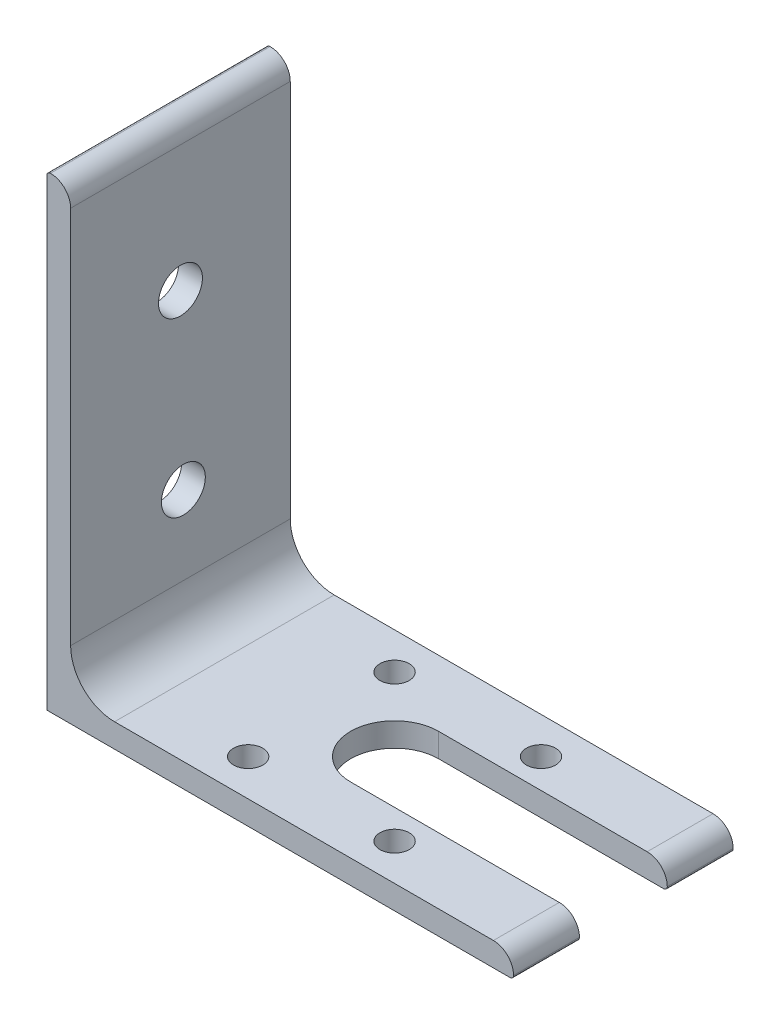
ISO-10303-21;
HEADER;
FILE_DESCRIPTION(('STEP AP214'),'2;1');
FILE_NAME('part.step','',(''),(''),'','','');
FILE_SCHEMA(('AUTOMOTIVE_DESIGN { 1 0 10303 214 1 1 1 1 }'));
ENDSEC;
DATA;
#1=APPLICATION_CONTEXT('core data for automotive mechanical design processes');
#2=APPLICATION_PROTOCOL_DEFINITION('international standard','automotive_design',2000,#1);
#3=PRODUCT_CONTEXT('',#1,'mechanical');
#4=PRODUCT('Part','Part','',(#3));
#5=PRODUCT_RELATED_PRODUCT_CATEGORY('part','',(#4));
#6=PRODUCT_DEFINITION_FORMATION('','',#4);
#7=PRODUCT_DEFINITION_CONTEXT('part definition',#1,'design');
#8=PRODUCT_DEFINITION('design','',#6,#7);
#9=PRODUCT_DEFINITION_SHAPE('','',#8);
#10=(LENGTH_UNIT() NAMED_UNIT(*) SI_UNIT(.MILLI.,.METRE.));
#11=(NAMED_UNIT(*) PLANE_ANGLE_UNIT() SI_UNIT($,.RADIAN.));
#12=(NAMED_UNIT(*) SI_UNIT($,.STERADIAN.) SOLID_ANGLE_UNIT());
#13=UNCERTAINTY_MEASURE_WITH_UNIT(LENGTH_MEASURE(1.E-05),#10,'distance_accuracy_value','');
#14=(GEOMETRIC_REPRESENTATION_CONTEXT(3) GLOBAL_UNCERTAINTY_ASSIGNED_CONTEXT((#13)) GLOBAL_UNIT_ASSIGNED_CONTEXT((#10,
#11,#12)) REPRESENTATION_CONTEXT('',''));
#15=CARTESIAN_POINT('',(0.,0.,0.));
#16=DIRECTION('',(0.,0.,1.));
#17=DIRECTION('',(1.,0.,0.));
#18=AXIS2_PLACEMENT_3D('',#15,#16,#17);
#19=CARTESIAN_POINT('',(61.,0.5,-30.));
#20=DIRECTION('',(0.,0.,1.));
#21=DIRECTION('',(1.,0.,0.));
#22=AXIS2_PLACEMENT_3D('',#19,#20,#21);
#23=CYLINDRICAL_SURFACE('',#22,2.75);
#24=CARTESIAN_POINT('',(61.,0.5,-21.0000000000003));
#25=DIRECTION('',(0.,0.,-1.));
#26=DIRECTION('',(-1.,0.,0.));
#27=AXIS2_PLACEMENT_3D('',#24,#25,#26);
#28=CIRCLE('',#27,2.75);
#29=CARTESIAN_POINT('',(63.75,0.499999999999981,-21.0000000000003));
#30=VERTEX_POINT('',#29);
#31=CARTESIAN_POINT('',(61.,3.25,-21.0000000000003));
#32=VERTEX_POINT('',#31);
#33=EDGE_CURVE('E307',#30,#32,#28,.F.);
#34=ORIENTED_EDGE('',*,*,#33,.F.);
#35=DIRECTION('',(0.,0.,1.));
#36=VECTOR('',#35,1.);
#37=CARTESIAN_POINT('',(63.75,0.499999999999981,-30.));
#38=LINE('',#37,#36);
#39=CARTESIAN_POINT('',(63.75,0.499999999999981,-30.));
#40=VERTEX_POINT('',#39);
#41=EDGE_CURVE('E206',#40,#30,#38,.T.);
#42=ORIENTED_EDGE('',*,*,#41,.F.);
#43=CARTESIAN_POINT('',(61.,0.5,-30.));
#44=DIRECTION('',(0.,0.,1.));
#45=DIRECTION('',(1.,0.,0.));
#46=AXIS2_PLACEMENT_3D('',#43,#44,#45);
#47=CIRCLE('',#46,2.75);
#48=CARTESIAN_POINT('',(61.,3.25,-30.));
#49=VERTEX_POINT('',#48);
#50=EDGE_CURVE('E342',#40,#49,#47,.T.);
#51=ORIENTED_EDGE('',*,*,#50,.T.);
#52=DIRECTION('',(0.,0.,1.));
#53=VECTOR('',#52,1.);
#54=CARTESIAN_POINT('',(61.,3.25,-30.));
#55=LINE('',#54,#53);
#56=EDGE_CURVE('E202',#49,#32,#55,.T.);
#57=ORIENTED_EDGE('',*,*,#56,.T.);
#58=EDGE_LOOP('',(#34,#42,#51,#57));
#59=FACE_BOUND('',#58,.T.);
#60=ADVANCED_FACE('F33',(#59),#23,.T.);
#61=CARTESIAN_POINT('',(63.75,0.499999999999981,-30.));
#62=DIRECTION('',(1.,0.,0.));
#63=DIRECTION('',(0.,0.,-1.));
#64=AXIS2_PLACEMENT_3D('',#61,#62,#63);
#65=PLANE('',#64);
#66=DIRECTION('',(0.,1.,0.));
#67=VECTOR('',#66,1.);
#68=CARTESIAN_POINT('',(63.75,0.499999999999981,-21.0000000000003));
#69=LINE('',#68,#67);
#70=CARTESIAN_POINT('',(63.75,0.490000000000003,-21.0000000000003));
#71=VERTEX_POINT('',#70);
#72=EDGE_CURVE('E304',#71,#30,#69,.T.);
#73=ORIENTED_EDGE('',*,*,#72,.F.);
#74=DIRECTION('',(0.,0.,1.));
#75=VECTOR('',#74,1.);
#76=CARTESIAN_POINT('',(63.75,0.490000000000003,-30.));
#77=LINE('',#76,#75);
#78=CARTESIAN_POINT('',(63.75,0.490000000000003,-30.));
#79=VERTEX_POINT('',#78);
#80=EDGE_CURVE('E210',#79,#71,#77,.T.);
#81=ORIENTED_EDGE('',*,*,#80,.F.);
#82=DIRECTION('',(0.,1.,0.));
#83=VECTOR('',#82,1.);
#84=CARTESIAN_POINT('',(63.75,0.499999999999981,-30.));
#85=LINE('',#84,#83);
#86=EDGE_CURVE('E339',#79,#40,#85,.T.);
#87=ORIENTED_EDGE('',*,*,#86,.T.);
#88=ORIENTED_EDGE('',*,*,#41,.T.);
#89=EDGE_LOOP('',(#73,#81,#87,#88));
#90=FACE_BOUND('',#89,.T.);
#91=ADVANCED_FACE('F242',(#90),#65,.T.);
#92=CARTESIAN_POINT('',(63.26,0.49,-30.));
#93=DIRECTION('',(0.,0.,1.));
#94=DIRECTION('',(1.,0.,0.));
#95=AXIS2_PLACEMENT_3D('',#92,#93,#94);
#96=CYLINDRICAL_SURFACE('',#95,0.490000000000002);
#97=CARTESIAN_POINT('',(63.26,0.49,-21.0000000000003));
#98=DIRECTION('',(0.,0.,-1.));
#99=DIRECTION('',(-1.,0.,0.));
#100=AXIS2_PLACEMENT_3D('',#97,#98,#99);
#101=CIRCLE('',#100,0.490000000000002);
#102=CARTESIAN_POINT('',(63.26,0.,-21.0000000000003));
#103=VERTEX_POINT('',#102);
#104=EDGE_CURVE('E284',#103,#71,#101,.F.);
#105=ORIENTED_EDGE('',*,*,#104,.F.);
#106=DIRECTION('',(0.,0.,1.));
#107=VECTOR('',#106,1.);
#108=CARTESIAN_POINT('',(63.26,0.,-30.));
#109=LINE('',#108,#107);
#110=CARTESIAN_POINT('',(63.26,0.,-30.));
#111=VERTEX_POINT('',#110);
#112=EDGE_CURVE('E214',#111,#103,#109,.T.);
#113=ORIENTED_EDGE('',*,*,#112,.F.);
#114=CARTESIAN_POINT('',(63.26,0.49,-30.));
#115=DIRECTION('',(0.,0.,1.));
#116=DIRECTION('',(1.,0.,0.));
#117=AXIS2_PLACEMENT_3D('',#114,#115,#116);
#118=CIRCLE('',#117,0.490000000000002);
#119=EDGE_CURVE('E336',#111,#79,#118,.T.);
#120=ORIENTED_EDGE('',*,*,#119,.T.);
#121=ORIENTED_EDGE('',*,*,#80,.T.);
#122=EDGE_LOOP('',(#105,#113,#120,#121));
#123=FACE_BOUND('',#122,.T.);
#124=ADVANCED_FACE('F233',(#123),#96,.T.);
#125=CARTESIAN_POINT('',(0.,0.,-30.));
#126=DIRECTION('',(-1.,0.,0.));
#127=DIRECTION('',(0.,0.,1.));
#128=AXIS2_PLACEMENT_3D('',#125,#126,#127);
#129=PLANE('',#128);
#130=CARTESIAN_POINT('',(0.,43.75,-15.));
#131=DIRECTION('',(-1.,0.,0.));
#132=DIRECTION('',(0.,0.,1.));
#133=AXIS2_PLACEMENT_3D('',#130,#131,#132);
#134=CIRCLE('',#133,3.);
#135=CARTESIAN_POINT('',(0.,43.75,-12.));
#136=VERTEX_POINT('',#135);
#137=EDGE_CURVE('E37',#136,#136,#134,.T.);
#138=ORIENTED_EDGE('',*,*,#137,.F.);
#139=EDGE_LOOP('',(#138));
#140=FACE_BOUND('',#139,.T.);
#141=CARTESIAN_POINT('',(0.,20.,-15.399206182849));
#142=DIRECTION('',(-1.,0.,0.));
#143=DIRECTION('',(0.,0.,1.));
#144=AXIS2_PLACEMENT_3D('',#141,#142,#143);
#145=CIRCLE('',#144,3.);
#146=CARTESIAN_POINT('',(0.,20.,-12.399206182849));
#147=VERTEX_POINT('',#146);
#148=EDGE_CURVE('E383',#147,#147,#145,.T.);
#149=ORIENTED_EDGE('',*,*,#148,.F.);
#150=EDGE_LOOP('',(#149));
#151=FACE_BOUND('',#150,.T.);
#152=DIRECTION('',(0.,-1.,0.));
#153=VECTOR('',#152,1.);
#154=CARTESIAN_POINT('',(0.,0.,0.));
#155=LINE('',#154,#153);
#156=CARTESIAN_POINT('',(0.,63.26,0.));
#157=VERTEX_POINT('',#156);
#158=CARTESIAN_POINT('',(0.,0.,0.));
#159=VERTEX_POINT('',#158);
#160=EDGE_CURVE('E163',#157,#159,#155,.T.);
#161=ORIENTED_EDGE('',*,*,#160,.F.);
#162=DIRECTION('',(0.,0.,1.));
#163=VECTOR('',#162,1.);
#164=CARTESIAN_POINT('',(0.,63.26,-30.));
#165=LINE('',#164,#163);
#166=CARTESIAN_POINT('',(0.,63.26,-30.));
#167=VERTEX_POINT('',#166);
#168=EDGE_CURVE('E42',#167,#157,#165,.T.);
#169=ORIENTED_EDGE('',*,*,#168,.F.);
#170=DIRECTION('',(0.,-1.,0.));
#171=VECTOR('',#170,1.);
#172=CARTESIAN_POINT('',(0.,0.,-30.));
#173=LINE('',#172,#171);
#174=CARTESIAN_POINT('',(0.,0.,-30.));
#175=VERTEX_POINT('',#174);
#176=EDGE_CURVE('E194',#167,#175,#173,.T.);
#177=ORIENTED_EDGE('',*,*,#176,.T.);
#178=DIRECTION('',(0.,0.,1.));
#179=VECTOR('',#178,1.);
#180=CARTESIAN_POINT('',(0.,0.,-30.));
#181=LINE('',#180,#179);
#182=EDGE_CURVE('E105',#175,#159,#181,.T.);
#183=ORIENTED_EDGE('',*,*,#182,.T.);
#184=EDGE_LOOP('',(#161,#169,#177,#183));
#185=FACE_BOUND('',#184,.T.);
#186=ADVANCED_FACE('F35',(#140,#151,#185),#129,.T.);
#187=CARTESIAN_POINT('',(0.49,63.26,-30.));
#188=DIRECTION('',(0.,0.,1.));
#189=DIRECTION('',(1.,0.,0.));
#190=AXIS2_PLACEMENT_3D('',#187,#188,#189);
#191=CYLINDRICAL_SURFACE('',#190,0.490000000000002);
#192=CARTESIAN_POINT('',(0.49,63.26,0.));
#193=DIRECTION('',(0.,0.,1.));
#194=DIRECTION('',(1.,0.,0.));
#195=AXIS2_PLACEMENT_3D('',#192,#193,#194);
#196=CIRCLE('',#195,0.490000000000002);
#197=CARTESIAN_POINT('',(0.49,63.75,0.));
#198=VERTEX_POINT('',#197);
#199=EDGE_CURVE('E191',#198,#157,#196,.T.);
#200=ORIENTED_EDGE('',*,*,#199,.F.);
#201=DIRECTION('',(0.,0.,1.));
#202=VECTOR('',#201,1.);
#203=CARTESIAN_POINT('',(0.49,63.75,-30.));
#204=LINE('',#203,#202);
#205=CARTESIAN_POINT('',(0.49,63.75,-30.));
#206=VERTEX_POINT('',#205);
#207=EDGE_CURVE('E144',#206,#198,#204,.T.);
#208=ORIENTED_EDGE('',*,*,#207,.F.);
#209=CARTESIAN_POINT('',(0.49,63.26,-30.));
#210=DIRECTION('',(0.,0.,1.));
#211=DIRECTION('',(1.,0.,0.));
#212=AXIS2_PLACEMENT_3D('',#209,#210,#211);
#213=CIRCLE('',#212,0.490000000000002);
#214=EDGE_CURVE('E153',#206,#167,#213,.T.);
#215=ORIENTED_EDGE('',*,*,#214,.T.);
#216=ORIENTED_EDGE('',*,*,#168,.T.);
#217=EDGE_LOOP('',(#200,#208,#215,#216));
#218=FACE_BOUND('',#217,.T.);
#219=ADVANCED_FACE('F232',(#218),#191,.T.);
#220=CARTESIAN_POINT('',(0.49,63.75,-30.));
#221=DIRECTION('',(0.,1.,0.));
#222=DIRECTION('',(0.,0.,1.));
#223=AXIS2_PLACEMENT_3D('',#220,#221,#222);
#224=PLANE('',#223);
#225=DIRECTION('',(-1.,0.,0.));
#226=VECTOR('',#225,1.);
#227=CARTESIAN_POINT('',(0.49,63.75,0.));
#228=LINE('',#227,#226);
#229=CARTESIAN_POINT('',(0.500000000000001,63.75,0.));
#230=VERTEX_POINT('',#229);
#231=EDGE_CURVE('E139',#230,#198,#228,.T.);
#232=ORIENTED_EDGE('',*,*,#231,.F.);
#233=DIRECTION('',(0.,0.,1.));
#234=VECTOR('',#233,1.);
#235=CARTESIAN_POINT('',(0.500000000000001,63.75,-30.));
#236=LINE('',#235,#234);
#237=CARTESIAN_POINT('',(0.500000000000001,63.75,-30.));
#238=VERTEX_POINT('',#237);
#239=EDGE_CURVE('E133',#238,#230,#236,.T.);
#240=ORIENTED_EDGE('',*,*,#239,.F.);
#241=DIRECTION('',(-1.,0.,0.));
#242=VECTOR('',#241,1.);
#243=CARTESIAN_POINT('',(0.49,63.75,-30.));
#244=LINE('',#243,#242);
#245=EDGE_CURVE('E136',#238,#206,#244,.T.);
#246=ORIENTED_EDGE('',*,*,#245,.T.);
#247=ORIENTED_EDGE('',*,*,#207,.T.);
#248=EDGE_LOOP('',(#232,#240,#246,#247));
#249=FACE_BOUND('',#248,.T.);
#250=ADVANCED_FACE('F135',(#249),#224,.T.);
#251=CARTESIAN_POINT('',(0.5,61.,-30.));
#252=DIRECTION('',(0.,0.,1.));
#253=DIRECTION('',(1.,0.,0.));
#254=AXIS2_PLACEMENT_3D('',#251,#252,#253);
#255=CYLINDRICAL_SURFACE('',#254,2.75);
#256=CARTESIAN_POINT('',(0.5,61.,0.));
#257=DIRECTION('',(0.,0.,1.));
#258=DIRECTION('',(1.,0.,0.));
#259=AXIS2_PLACEMENT_3D('',#256,#257,#258);
#260=CIRCLE('',#259,2.75);
#261=CARTESIAN_POINT('',(3.25,61.,0.));
#262=VERTEX_POINT('',#261);
#263=EDGE_CURVE('E188',#262,#230,#260,.T.);
#264=ORIENTED_EDGE('',*,*,#263,.F.);
#265=DIRECTION('',(0.,0.,1.));
#266=VECTOR('',#265,1.);
#267=CARTESIAN_POINT('',(3.25,61.,-30.));
#268=LINE('',#267,#266);
#269=CARTESIAN_POINT('',(3.25,61.,-30.));
#270=VERTEX_POINT('',#269);
#271=EDGE_CURVE('E145',#270,#262,#268,.T.);
#272=ORIENTED_EDGE('',*,*,#271,.F.);
#273=CARTESIAN_POINT('',(0.5,61.,-30.));
#274=DIRECTION('',(0.,0.,1.));
#275=DIRECTION('',(1.,0.,0.));
#276=AXIS2_PLACEMENT_3D('',#273,#274,#275);
#277=CIRCLE('',#276,2.75);
#278=EDGE_CURVE('E151',#270,#238,#277,.T.);
#279=ORIENTED_EDGE('',*,*,#278,.T.);
#280=ORIENTED_EDGE('',*,*,#239,.T.);
#281=EDGE_LOOP('',(#264,#272,#279,#280));
#282=FACE_BOUND('',#281,.T.);
#283=ADVANCED_FACE('F155',(#282),#255,.T.);
#284=CARTESIAN_POINT('',(3.25,61.,-30.));
#285=DIRECTION('',(1.,0.,0.));
#286=DIRECTION('',(0.,1.,0.));
#287=AXIS2_PLACEMENT_3D('',#284,#285,#286);
#288=PLANE('',#287);
#289=CARTESIAN_POINT('',(3.25,43.75,-15.));
#290=DIRECTION('',(1.,0.,0.));
#291=DIRECTION('',(0.,0.,-1.));
#292=AXIS2_PLACEMENT_3D('',#289,#290,#291);
#293=CIRCLE('',#292,3.);
#294=CARTESIAN_POINT('',(3.25,43.75,-18.));
#295=VERTEX_POINT('',#294);
#296=EDGE_CURVE('E541',#295,#295,#293,.T.);
#297=ORIENTED_EDGE('',*,*,#296,.F.);
#298=EDGE_LOOP('',(#297));
#299=FACE_BOUND('',#298,.T.);
#300=CARTESIAN_POINT('',(3.25000000000001,20.,-15.399206182849));
#301=DIRECTION('',(1.,0.,0.));
#302=DIRECTION('',(0.,0.,-1.));
#303=AXIS2_PLACEMENT_3D('',#300,#301,#302);
#304=CIRCLE('',#303,3.);
#305=CARTESIAN_POINT('',(3.25000000000001,20.,-18.399206182849));
#306=VERTEX_POINT('',#305);
#307=EDGE_CURVE('E543',#306,#306,#304,.T.);
#308=ORIENTED_EDGE('',*,*,#307,.F.);
#309=EDGE_LOOP('',(#308));
#310=FACE_BOUND('',#309,.T.);
#311=DIRECTION('',(0.,1.,0.));
#312=VECTOR('',#311,1.);
#313=CARTESIAN_POINT('',(3.25,61.,0.));
#314=LINE('',#313,#312);
#315=CARTESIAN_POINT('',(3.25000000000001,9.25000000000004,0.));
#316=VERTEX_POINT('',#315);
#317=EDGE_CURVE('E185',#316,#262,#314,.T.);
#318=ORIENTED_EDGE('',*,*,#317,.F.);
#319=DIRECTION('',(0.,0.,1.));
#320=VECTOR('',#319,1.);
#321=CARTESIAN_POINT('',(3.25000000000001,9.25000000000004,-30.));
#322=LINE('',#321,#320);
#323=CARTESIAN_POINT('',(3.25000000000001,9.25000000000004,-30.));
#324=VERTEX_POINT('',#323);
#325=EDGE_CURVE('E198',#324,#316,#322,.T.);
#326=ORIENTED_EDGE('',*,*,#325,.F.);
#327=DIRECTION('',(0.,1.,0.));
#328=VECTOR('',#327,1.);
#329=CARTESIAN_POINT('',(3.25,61.,-30.));
#330=LINE('',#329,#328);
#331=EDGE_CURVE('E156',#324,#270,#330,.T.);
#332=ORIENTED_EDGE('',*,*,#331,.T.);
#333=ORIENTED_EDGE('',*,*,#271,.T.);
#334=EDGE_LOOP('',(#318,#326,#332,#333));
#335=FACE_BOUND('',#334,.T.);
#336=ADVANCED_FACE('F429',(#299,#310,#335),#288,.T.);
#337=CARTESIAN_POINT('',(9.25000000000001,9.25,-30.));
#338=DIRECTION('',(0.,0.,1.));
#339=DIRECTION('',(1.,0.,0.));
#340=AXIS2_PLACEMENT_3D('',#337,#338,#339);
#341=CYLINDRICAL_SURFACE('',#340,6.);
#342=CARTESIAN_POINT('',(9.25000000000001,9.25,0.));
#343=DIRECTION('',(0.,0.,-1.));
#344=DIRECTION('',(-1.,0.,0.));
#345=AXIS2_PLACEMENT_3D('',#342,#343,#344);
#346=CIRCLE('',#345,6.);
#347=CARTESIAN_POINT('',(9.25000000000005,3.25,0.));
#348=VERTEX_POINT('',#347);
#349=EDGE_CURVE('E182',#348,#316,#346,.T.);
#350=ORIENTED_EDGE('',*,*,#349,.F.);
#351=DIRECTION('',(0.,0.,1.));
#352=VECTOR('',#351,1.);
#353=CARTESIAN_POINT('',(9.25000000000005,3.25,-30.));
#354=LINE('',#353,#352);
#355=CARTESIAN_POINT('',(9.25000000000005,3.25,-30.));
#356=VERTEX_POINT('',#355);
#357=EDGE_CURVE('E200',#356,#348,#354,.T.);
#358=ORIENTED_EDGE('',*,*,#357,.F.);
#359=CARTESIAN_POINT('',(9.25000000000001,9.25,-30.));
#360=DIRECTION('',(0.,0.,-1.));
#361=DIRECTION('',(-1.,0.,0.));
#362=AXIS2_PLACEMENT_3D('',#359,#360,#361);
#363=CIRCLE('',#362,6.);
#364=EDGE_CURVE('E158',#356,#324,#363,.T.);
#365=ORIENTED_EDGE('',*,*,#364,.T.);
#366=ORIENTED_EDGE('',*,*,#325,.T.);
#367=EDGE_LOOP('',(#350,#358,#365,#366));
#368=FACE_BOUND('',#367,.T.);
#369=ADVANCED_FACE('F268',(#368),#341,.F.);
#370=CARTESIAN_POINT('',(9.25000000000005,3.25,-30.));
#371=DIRECTION('',(0.,1.,0.));
#372=DIRECTION('',(0.,0.,1.));
#373=AXIS2_PLACEMENT_3D('',#370,#371,#372);
#374=PLANE('',#373);
#375=DIRECTION('',(-1.,0.,0.));
#376=VECTOR('',#375,1.);
#377=CARTESIAN_POINT('',(32.499999999993,3.25,-21.0000000000003));
#378=LINE('',#377,#376);
#379=CARTESIAN_POINT('',(32.499999999993,3.25,-21.0000000000003));
#380=VERTEX_POINT('',#379);
#381=EDGE_CURVE('E353',#32,#380,#378,.T.);
#382=ORIENTED_EDGE('',*,*,#381,.F.);
#383=ORIENTED_EDGE('',*,*,#56,.F.);
#384=DIRECTION('',(-1.,0.,0.));
#385=VECTOR('',#384,1.);
#386=CARTESIAN_POINT('',(9.25000000000005,3.25,-30.));
#387=LINE('',#386,#385);
#388=EDGE_CURVE('E345',#49,#356,#387,.T.);
#389=ORIENTED_EDGE('',*,*,#388,.T.);
#390=ORIENTED_EDGE('',*,*,#357,.T.);
#391=DIRECTION('',(-1.,0.,0.));
#392=VECTOR('',#391,1.);
#393=CARTESIAN_POINT('',(9.25000000000005,3.25,0.));
#394=LINE('',#393,#392);
#395=CARTESIAN_POINT('',(61.,3.25,0.));
#396=VERTEX_POINT('',#395);
#397=EDGE_CURVE('E179',#396,#348,#394,.T.);
#398=ORIENTED_EDGE('',*,*,#397,.F.);
#399=CARTESIAN_POINT('',(61.,3.25,-9.00000000000028));
#400=VERTEX_POINT('',#399);
#401=EDGE_CURVE('E205',#400,#396,#55,.T.);
#402=ORIENTED_EDGE('',*,*,#401,.F.);
#403=DIRECTION('',(1.,0.,0.));
#404=VECTOR('',#403,1.);
#405=CARTESIAN_POINT('',(32.499999999993,3.25,-9.00000000000028));
#406=LINE('',#405,#404);
#407=CARTESIAN_POINT('',(32.499999999993,3.25,-9.00000000000028));
#408=VERTEX_POINT('',#407);
#409=EDGE_CURVE('E292',#408,#400,#406,.T.);
#410=ORIENTED_EDGE('',*,*,#409,.F.);
#411=CARTESIAN_POINT('',(32.499999999993,3.25,-15.0000000000003));
#412=DIRECTION('',(0.,1.,0.));
#413=DIRECTION('',(0.,0.,1.));
#414=AXIS2_PLACEMENT_3D('',#411,#412,#413);
#415=CIRCLE('',#414,6.00000000000001);
#416=EDGE_CURVE('E386',#380,#408,#415,.T.);
#417=ORIENTED_EDGE('',*,*,#416,.F.);
#418=EDGE_LOOP('',(#382,#383,#389,#390,#398,#402,#410,#417));
#419=FACE_BOUND('',#418,.T.);
#420=CARTESIAN_POINT('',(22.4999999999933,3.25,-5.));
#421=DIRECTION('',(0.,1.,0.));
#422=DIRECTION('',(0.,0.,1.));
#423=AXIS2_PLACEMENT_3D('',#420,#421,#422);
#424=CIRCLE('',#423,1.99999999999999);
#425=CARTESIAN_POINT('',(22.4999999999933,3.25,-3.00000000000001));
#426=VERTEX_POINT('',#425);
#427=EDGE_CURVE('E310',#426,#426,#424,.T.);
#428=ORIENTED_EDGE('',*,*,#427,.F.);
#429=EDGE_LOOP('',(#428));
#430=FACE_BOUND('',#429,.T.);
#431=CARTESIAN_POINT('',(22.4999999999927,3.25,-25.));
#432=DIRECTION('',(0.,1.,0.));
#433=DIRECTION('',(0.,0.,1.));
#434=AXIS2_PLACEMENT_3D('',#431,#432,#433);
#435=CIRCLE('',#434,1.99999999999999);
#436=CARTESIAN_POINT('',(22.4999999999927,3.25,-23.));
#437=VERTEX_POINT('',#436);
#438=EDGE_CURVE('E316',#437,#437,#435,.T.);
#439=ORIENTED_EDGE('',*,*,#438,.F.);
#440=EDGE_LOOP('',(#439));
#441=FACE_BOUND('',#440,.T.);
#442=CARTESIAN_POINT('',(42.4999999999927,3.25,-25.0000000000006));
#443=DIRECTION('',(0.,1.,0.));
#444=DIRECTION('',(0.,0.,1.));
#445=AXIS2_PLACEMENT_3D('',#442,#443,#444);
#446=CIRCLE('',#445,1.99999999999999);
#447=CARTESIAN_POINT('',(42.4999999999927,3.25,-23.0000000000006));
#448=VERTEX_POINT('',#447);
#449=EDGE_CURVE('E322',#448,#448,#446,.T.);
#450=ORIENTED_EDGE('',*,*,#449,.F.);
#451=EDGE_LOOP('',(#450));
#452=FACE_BOUND('',#451,.T.);
#453=CARTESIAN_POINT('',(42.4999999999933,3.25,-5.00000000000056));
#454=DIRECTION('',(0.,1.,0.));
#455=DIRECTION('',(0.,0.,1.));
#456=AXIS2_PLACEMENT_3D('',#453,#454,#455);
#457=CIRCLE('',#456,1.99999999999999);
#458=CARTESIAN_POINT('',(42.4999999999933,3.25,-3.00000000000058));
#459=VERTEX_POINT('',#458);
#460=EDGE_CURVE('E328',#459,#459,#457,.T.);
#461=ORIENTED_EDGE('',*,*,#460,.F.);
#462=EDGE_LOOP('',(#461));
#463=FACE_BOUND('',#462,.T.);
#464=ADVANCED_FACE('F261',(#419,#430,#441,#452,#463),#374,.T.);
#465=CARTESIAN_POINT('',(61.,0.5,-9.00000000000028));
#466=DIRECTION('',(0.,0.,1.));
#467=DIRECTION('',(1.,0.,0.));
#468=AXIS2_PLACEMENT_3D('',#465,#466,#467);
#469=CIRCLE('',#468,2.75);
#470=CARTESIAN_POINT('',(63.75,0.499999999999981,-9.00000000000028));
#471=VERTEX_POINT('',#470);
#472=EDGE_CURVE('E274',#400,#471,#469,.F.);
#473=ORIENTED_EDGE('',*,*,#472,.F.);
#474=ORIENTED_EDGE('',*,*,#401,.T.);
#475=CARTESIAN_POINT('',(61.,0.5,0.));
#476=DIRECTION('',(0.,0.,1.));
#477=DIRECTION('',(1.,0.,0.));
#478=AXIS2_PLACEMENT_3D('',#475,#476,#477);
#479=CIRCLE('',#478,2.75);
#480=CARTESIAN_POINT('',(63.75,0.499999999999981,0.));
#481=VERTEX_POINT('',#480);
#482=EDGE_CURVE('E176',#481,#396,#479,.T.);
#483=ORIENTED_EDGE('',*,*,#482,.F.);
#484=EDGE_CURVE('E209',#471,#481,#38,.T.);
#485=ORIENTED_EDGE('',*,*,#484,.F.);
#486=EDGE_LOOP('',(#473,#474,#483,#485));
#487=FACE_BOUND('',#486,.T.);
#488=ADVANCED_FACE('F250',(#487),#23,.T.);
#489=DIRECTION('',(0.,-1.,0.));
#490=VECTOR('',#489,1.);
#491=CARTESIAN_POINT('',(63.75,0.499999999999981,-9.00000000000028));
#492=LINE('',#491,#490);
#493=CARTESIAN_POINT('',(63.75,0.49,-9.00000000000028));
#494=VERTEX_POINT('',#493);
#495=EDGE_CURVE('E285',#471,#494,#492,.T.);
#496=ORIENTED_EDGE('',*,*,#495,.F.);
#497=ORIENTED_EDGE('',*,*,#484,.T.);
#498=DIRECTION('',(0.,1.,0.));
#499=VECTOR('',#498,1.);
#500=CARTESIAN_POINT('',(63.75,0.499999999999981,0.));
#501=LINE('',#500,#499);
#502=CARTESIAN_POINT('',(63.75,0.490000000000003,0.));
#503=VERTEX_POINT('',#502);
#504=EDGE_CURVE('E173',#503,#481,#501,.T.);
#505=ORIENTED_EDGE('',*,*,#504,.F.);
#506=EDGE_CURVE('E213',#494,#503,#77,.T.);
#507=ORIENTED_EDGE('',*,*,#506,.F.);
#508=EDGE_LOOP('',(#496,#497,#505,#507));
#509=FACE_BOUND('',#508,.T.);
#510=ADVANCED_FACE('F257',(#509),#65,.T.);
#511=CARTESIAN_POINT('',(63.26,0.49,-9.00000000000028));
#512=DIRECTION('',(0.,0.,1.));
#513=DIRECTION('',(1.,0.,0.));
#514=AXIS2_PLACEMENT_3D('',#511,#512,#513);
#515=CIRCLE('',#514,0.490000000000002);
#516=CARTESIAN_POINT('',(63.26,0.,-9.00000000000028));
#517=VERTEX_POINT('',#516);
#518=EDGE_CURVE('E49',#494,#517,#515,.F.);
#519=ORIENTED_EDGE('',*,*,#518,.F.);
#520=ORIENTED_EDGE('',*,*,#506,.T.);
#521=CARTESIAN_POINT('',(63.26,0.49,0.));
#522=DIRECTION('',(0.,0.,1.));
#523=DIRECTION('',(1.,0.,0.));
#524=AXIS2_PLACEMENT_3D('',#521,#522,#523);
#525=CIRCLE('',#524,0.490000000000002);
#526=CARTESIAN_POINT('',(63.26,0.,0.));
#527=VERTEX_POINT('',#526);
#528=EDGE_CURVE('E170',#527,#503,#525,.T.);
#529=ORIENTED_EDGE('',*,*,#528,.F.);
#530=EDGE_CURVE('E217',#517,#527,#109,.T.);
#531=ORIENTED_EDGE('',*,*,#530,.F.);
#532=EDGE_LOOP('',(#519,#520,#529,#531));
#533=FACE_BOUND('',#532,.T.);
#534=ADVANCED_FACE('F226',(#533),#96,.T.);
#535=CARTESIAN_POINT('',(0.,0.,-30.));
#536=DIRECTION('',(0.,-1.,0.));
#537=DIRECTION('',(0.,0.,-1.));
#538=AXIS2_PLACEMENT_3D('',#535,#536,#537);
#539=PLANE('',#538);
#540=DIRECTION('',(1.,0.,0.));
#541=VECTOR('',#540,1.);
#542=CARTESIAN_POINT('',(0.,0.,-21.0000000000003));
#543=LINE('',#542,#541);
#544=CARTESIAN_POINT('',(32.499999999993,0.,-21.0000000000003));
#545=VERTEX_POINT('',#544);
#546=EDGE_CURVE('E11',#545,#103,#543,.T.);
#547=ORIENTED_EDGE('',*,*,#546,.F.);
#548=CARTESIAN_POINT('',(32.499999999993,0.,-15.0000000000003));
#549=DIRECTION('',(0.,1.,0.));
#550=DIRECTION('',(0.,0.,1.));
#551=AXIS2_PLACEMENT_3D('',#548,#549,#550);
#552=CIRCLE('',#551,6.00000000000001);
#553=CARTESIAN_POINT('',(32.499999999993,0.,-9.00000000000028));
#554=VERTEX_POINT('',#553);
#555=EDGE_CURVE('E367',#545,#554,#552,.T.);
#556=ORIENTED_EDGE('',*,*,#555,.T.);
#557=DIRECTION('',(1.,0.,0.));
#558=VECTOR('',#557,1.);
#559=CARTESIAN_POINT('',(32.499999999993,0.,-9.00000000000028));
#560=LINE('',#559,#558);
#561=EDGE_CURVE('E224',#554,#517,#560,.T.);
#562=ORIENTED_EDGE('',*,*,#561,.T.);
#563=ORIENTED_EDGE('',*,*,#530,.T.);
#564=DIRECTION('',(1.,0.,0.));
#565=VECTOR('',#564,1.);
#566=CARTESIAN_POINT('',(0.,0.,0.));
#567=LINE('',#566,#565);
#568=EDGE_CURVE('E166',#159,#527,#567,.T.);
#569=ORIENTED_EDGE('',*,*,#568,.F.);
#570=ORIENTED_EDGE('',*,*,#182,.F.);
#571=DIRECTION('',(1.,0.,0.));
#572=VECTOR('',#571,1.);
#573=CARTESIAN_POINT('',(0.,0.,-30.));
#574=LINE('',#573,#572);
#575=EDGE_CURVE('E334',#175,#111,#574,.T.);
#576=ORIENTED_EDGE('',*,*,#575,.T.);
#577=ORIENTED_EDGE('',*,*,#112,.T.);
#578=EDGE_LOOP('',(#547,#556,#562,#563,#569,#570,#576,#577));
#579=FACE_BOUND('',#578,.T.);
#580=CARTESIAN_POINT('',(22.4999999999933,0.,-5.));
#581=DIRECTION('',(0.,-1.,0.));
#582=DIRECTION('',(0.,0.,-1.));
#583=AXIS2_PLACEMENT_3D('',#580,#581,#582);
#584=CIRCLE('',#583,1.99999999999999);
#585=CARTESIAN_POINT('',(22.4999999999933,0.,-6.99999999999999));
#586=VERTEX_POINT('',#585);
#587=EDGE_CURVE('E313',#586,#586,#584,.T.);
#588=ORIENTED_EDGE('',*,*,#587,.F.);
#589=EDGE_LOOP('',(#588));
#590=FACE_BOUND('',#589,.T.);
#591=CARTESIAN_POINT('',(22.4999999999927,0.,-25.));
#592=DIRECTION('',(0.,-1.,0.));
#593=DIRECTION('',(0.,0.,-1.));
#594=AXIS2_PLACEMENT_3D('',#591,#592,#593);
#595=CIRCLE('',#594,1.99999999999999);
#596=CARTESIAN_POINT('',(22.4999999999927,0.,-27.));
#597=VERTEX_POINT('',#596);
#598=EDGE_CURVE('E319',#597,#597,#595,.T.);
#599=ORIENTED_EDGE('',*,*,#598,.F.);
#600=EDGE_LOOP('',(#599));
#601=FACE_BOUND('',#600,.T.);
#602=CARTESIAN_POINT('',(42.4999999999927,0.,-25.0000000000006));
#603=DIRECTION('',(0.,-1.,0.));
#604=DIRECTION('',(0.,0.,-1.));
#605=AXIS2_PLACEMENT_3D('',#602,#603,#604);
#606=CIRCLE('',#605,1.99999999999999);
#607=CARTESIAN_POINT('',(42.4999999999927,0.,-27.0000000000005));
#608=VERTEX_POINT('',#607);
#609=EDGE_CURVE('E325',#608,#608,#606,.T.);
#610=ORIENTED_EDGE('',*,*,#609,.F.);
#611=EDGE_LOOP('',(#610));
#612=FACE_BOUND('',#611,.T.);
#613=CARTESIAN_POINT('',(42.4999999999933,0.,-5.00000000000056));
#614=DIRECTION('',(0.,-1.,0.));
#615=DIRECTION('',(0.,0.,-1.));
#616=AXIS2_PLACEMENT_3D('',#613,#614,#615);
#617=CIRCLE('',#616,1.99999999999999);
#618=CARTESIAN_POINT('',(42.4999999999933,0.,-7.00000000000055));
#619=VERTEX_POINT('',#618);
#620=EDGE_CURVE('E167',#619,#619,#617,.T.);
#621=ORIENTED_EDGE('',*,*,#620,.F.);
#622=EDGE_LOOP('',(#621));
#623=FACE_BOUND('',#622,.T.);
#624=ADVANCED_FACE('F221',(#579,#590,#601,#612,#623),#539,.T.);
#625=CARTESIAN_POINT('',(0.49,63.26,-30.));
#626=DIRECTION('',(0.,0.,1.));
#627=DIRECTION('',(1.,0.,0.));
#628=AXIS2_PLACEMENT_3D('',#625,#626,#627);
#629=PLANE('',#628);
#630=ORIENTED_EDGE('',*,*,#176,.F.);
#631=ORIENTED_EDGE('',*,*,#214,.F.);
#632=ORIENTED_EDGE('',*,*,#245,.F.);
#633=ORIENTED_EDGE('',*,*,#278,.F.);
#634=ORIENTED_EDGE('',*,*,#331,.F.);
#635=ORIENTED_EDGE('',*,*,#364,.F.);
#636=ORIENTED_EDGE('',*,*,#388,.F.);
#637=ORIENTED_EDGE('',*,*,#50,.F.);
#638=ORIENTED_EDGE('',*,*,#86,.F.);
#639=ORIENTED_EDGE('',*,*,#119,.F.);
#640=ORIENTED_EDGE('',*,*,#575,.F.);
#641=EDGE_LOOP('',(#630,#631,#632,#633,#634,#635,#636,#637,#638,#639,#640));
#642=FACE_BOUND('',#641,.T.);
#643=ADVANCED_FACE('F149',(#642),#629,.F.);
#644=CARTESIAN_POINT('',(0.49,63.26,0.));
#645=DIRECTION('',(0.,0.,1.));
#646=DIRECTION('',(1.,0.,0.));
#647=AXIS2_PLACEMENT_3D('',#644,#645,#646);
#648=PLANE('',#647);
#649=ORIENTED_EDGE('',*,*,#160,.T.);
#650=ORIENTED_EDGE('',*,*,#568,.T.);
#651=ORIENTED_EDGE('',*,*,#528,.T.);
#652=ORIENTED_EDGE('',*,*,#504,.T.);
#653=ORIENTED_EDGE('',*,*,#482,.T.);
#654=ORIENTED_EDGE('',*,*,#397,.T.);
#655=ORIENTED_EDGE('',*,*,#349,.T.);
#656=ORIENTED_EDGE('',*,*,#317,.T.);
#657=ORIENTED_EDGE('',*,*,#263,.T.);
#658=ORIENTED_EDGE('',*,*,#231,.T.);
#659=ORIENTED_EDGE('',*,*,#199,.T.);
#660=EDGE_LOOP('',(#649,#650,#651,#652,#653,#654,#655,#656,#657,#658,#659));
#661=FACE_BOUND('',#660,.T.);
#662=ADVANCED_FACE('F230',(#661),#648,.T.);
#663=CARTESIAN_POINT('',(42.4999999999933,3.25,-5.00000000000056));
#664=DIRECTION('',(0.,1.,0.));
#665=DIRECTION('',(0.,0.,1.));
#666=AXIS2_PLACEMENT_3D('',#663,#664,#665);
#667=CYLINDRICAL_SURFACE('',#666,1.99999999999999);
#668=ORIENTED_EDGE('',*,*,#620,.T.);
#669=EDGE_LOOP('',(#668));
#670=FACE_BOUND('',#669,.T.);
#671=ORIENTED_EDGE('',*,*,#460,.T.);
#672=EDGE_LOOP('',(#671));
#673=FACE_BOUND('',#672,.T.);
#674=ADVANCED_FACE('F416',(#670,#673),#667,.F.);
#675=CARTESIAN_POINT('',(42.4999999999927,3.25,-25.0000000000006));
#676=DIRECTION('',(0.,1.,0.));
#677=DIRECTION('',(0.,0.,1.));
#678=AXIS2_PLACEMENT_3D('',#675,#676,#677);
#679=CYLINDRICAL_SURFACE('',#678,1.99999999999999);
#680=ORIENTED_EDGE('',*,*,#609,.T.);
#681=EDGE_LOOP('',(#680));
#682=FACE_BOUND('',#681,.T.);
#683=ORIENTED_EDGE('',*,*,#449,.T.);
#684=EDGE_LOOP('',(#683));
#685=FACE_BOUND('',#684,.T.);
#686=ADVANCED_FACE('F412',(#682,#685),#679,.F.);
#687=CARTESIAN_POINT('',(22.4999999999927,3.25,-25.));
#688=DIRECTION('',(0.,1.,0.));
#689=DIRECTION('',(0.,0.,1.));
#690=AXIS2_PLACEMENT_3D('',#687,#688,#689);
#691=CYLINDRICAL_SURFACE('',#690,1.99999999999999);
#692=ORIENTED_EDGE('',*,*,#598,.T.);
#693=EDGE_LOOP('',(#692));
#694=FACE_BOUND('',#693,.T.);
#695=ORIENTED_EDGE('',*,*,#438,.T.);
#696=EDGE_LOOP('',(#695));
#697=FACE_BOUND('',#696,.T.);
#698=ADVANCED_FACE('F408',(#694,#697),#691,.F.);
#699=CARTESIAN_POINT('',(22.4999999999933,3.25,-5.));
#700=DIRECTION('',(0.,1.,0.));
#701=DIRECTION('',(0.,0.,1.));
#702=AXIS2_PLACEMENT_3D('',#699,#700,#701);
#703=CYLINDRICAL_SURFACE('',#702,1.99999999999999);
#704=ORIENTED_EDGE('',*,*,#587,.T.);
#705=EDGE_LOOP('',(#704));
#706=FACE_BOUND('',#705,.T.);
#707=ORIENTED_EDGE('',*,*,#427,.T.);
#708=EDGE_LOOP('',(#707));
#709=FACE_BOUND('',#708,.T.);
#710=ADVANCED_FACE('F405',(#706,#709),#703,.F.);
#711=CARTESIAN_POINT('',(32.499999999993,0.,-15.0000000000003));
#712=DIRECTION('',(0.,1.,0.));
#713=DIRECTION('',(0.,0.,1.));
#714=AXIS2_PLACEMENT_3D('',#711,#712,#713);
#715=CYLINDRICAL_SURFACE('',#714,6.00000000000001);
#716=ORIENTED_EDGE('',*,*,#416,.T.);
#717=DIRECTION('',(0.,1.,0.));
#718=VECTOR('',#717,1.);
#719=CARTESIAN_POINT('',(32.499999999993,0.,-9.00000000000028));
#720=LINE('',#719,#718);
#721=EDGE_CURVE('E374',#554,#408,#720,.T.);
#722=ORIENTED_EDGE('',*,*,#721,.F.);
#723=ORIENTED_EDGE('',*,*,#555,.F.);
#724=DIRECTION('',(0.,1.,0.));
#725=VECTOR('',#724,1.);
#726=CARTESIAN_POINT('',(32.499999999993,0.,-21.0000000000003));
#727=LINE('',#726,#725);
#728=EDGE_CURVE('E298',#545,#380,#727,.T.);
#729=ORIENTED_EDGE('',*,*,#728,.T.);
#730=EDGE_LOOP('',(#716,#722,#723,#729));
#731=FACE_BOUND('',#730,.T.);
#732=ADVANCED_FACE('F377',(#731),#715,.F.);
#733=CARTESIAN_POINT('',(32.499999999993,0.,-21.0000000000003));
#734=DIRECTION('',(0.,0.,-1.));
#735=DIRECTION('',(-1.,0.,0.));
#736=AXIS2_PLACEMENT_3D('',#733,#734,#735);
#737=PLANE('',#736);
#738=ORIENTED_EDGE('',*,*,#33,.T.);
#739=ORIENTED_EDGE('',*,*,#381,.T.);
#740=ORIENTED_EDGE('',*,*,#728,.F.);
#741=ORIENTED_EDGE('',*,*,#546,.T.);
#742=ORIENTED_EDGE('',*,*,#104,.T.);
#743=ORIENTED_EDGE('',*,*,#72,.T.);
#744=EDGE_LOOP('',(#738,#739,#740,#741,#742,#743));
#745=FACE_BOUND('',#744,.T.);
#746=ADVANCED_FACE('F362',(#745),#737,.F.);
#747=CARTESIAN_POINT('',(32.499999999993,0.,-9.00000000000028));
#748=DIRECTION('',(0.,0.,1.));
#749=DIRECTION('',(1.,0.,0.));
#750=AXIS2_PLACEMENT_3D('',#747,#748,#749);
#751=PLANE('',#750);
#752=ORIENTED_EDGE('',*,*,#472,.T.);
#753=ORIENTED_EDGE('',*,*,#495,.T.);
#754=ORIENTED_EDGE('',*,*,#518,.T.);
#755=ORIENTED_EDGE('',*,*,#561,.F.);
#756=ORIENTED_EDGE('',*,*,#721,.T.);
#757=ORIENTED_EDGE('',*,*,#409,.T.);
#758=EDGE_LOOP('',(#752,#753,#754,#755,#756,#757));
#759=FACE_BOUND('',#758,.T.);
#760=ADVANCED_FACE('F388',(#759),#751,.F.);
#761=CARTESIAN_POINT('',(3.25000000000001,20.,-15.399206182849));
#762=DIRECTION('',(1.,0.,0.));
#763=DIRECTION('',(0.,0.,-1.));
#764=AXIS2_PLACEMENT_3D('',#761,#762,#763);
#765=CYLINDRICAL_SURFACE('',#764,3.);
#766=ORIENTED_EDGE('',*,*,#148,.T.);
#767=EDGE_LOOP('',(#766));
#768=FACE_BOUND('',#767,.T.);
#769=ORIENTED_EDGE('',*,*,#307,.T.);
#770=EDGE_LOOP('',(#769));
#771=FACE_BOUND('',#770,.T.);
#772=ADVANCED_FACE('F393',(#768,#771),#765,.F.);
#773=CARTESIAN_POINT('',(3.25,43.75,-15.));
#774=DIRECTION('',(1.,0.,0.));
#775=DIRECTION('',(0.,0.,-1.));
#776=AXIS2_PLACEMENT_3D('',#773,#774,#775);
#777=CYLINDRICAL_SURFACE('',#776,3.);
#778=ORIENTED_EDGE('',*,*,#137,.T.);
#779=EDGE_LOOP('',(#778));
#780=FACE_BOUND('',#779,.T.);
#781=ORIENTED_EDGE('',*,*,#296,.T.);
#782=EDGE_LOOP('',(#781));
#783=FACE_BOUND('',#782,.T.);
#784=ADVANCED_FACE('F398',(#780,#783),#777,.F.);
#785=CLOSED_SHELL('',(#60,#91,#124,#186,#219,#250,#283,#336,#369,#464,#488,#510,#534,#624,#643,
#662,#674,#686,#698,#710,#732,#746,#760,#772,#784));
#786=MANIFOLD_SOLID_BREP('B2',#785);
#787=ADVANCED_BREP_SHAPE_REPRESENTATION('',(#18,#786),#14);
#788=SHAPE_DEFINITION_REPRESENTATION(#9,#787);
ENDSEC;
END-ISO-10303-21;
